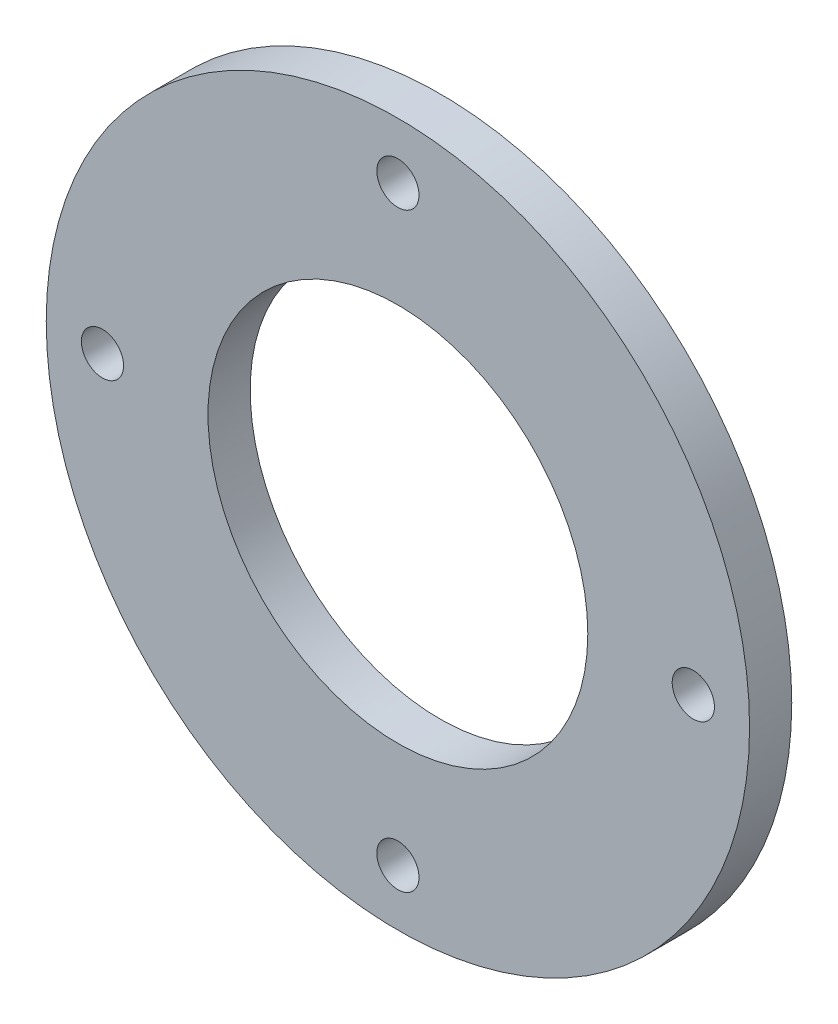
ISO-10303-21;
HEADER;
FILE_DESCRIPTION(('STEP AP214'),'2;1');
FILE_NAME('part.step','',(''),(''),'','','');
FILE_SCHEMA(('AUTOMOTIVE_DESIGN { 1 0 10303 214 1 1 1 1 }'));
ENDSEC;
DATA;
#1=APPLICATION_CONTEXT('core data for automotive mechanical design processes');
#2=APPLICATION_PROTOCOL_DEFINITION('international standard','automotive_design',2000,#1);
#3=PRODUCT_CONTEXT('',#1,'mechanical');
#4=PRODUCT('Part','Part','',(#3));
#5=PRODUCT_RELATED_PRODUCT_CATEGORY('part','',(#4));
#6=PRODUCT_DEFINITION_FORMATION('','',#4);
#7=PRODUCT_DEFINITION_CONTEXT('part definition',#1,'design');
#8=PRODUCT_DEFINITION('design','',#6,#7);
#9=PRODUCT_DEFINITION_SHAPE('','',#8);
#10=(LENGTH_UNIT() NAMED_UNIT(*) SI_UNIT(.MILLI.,.METRE.));
#11=(NAMED_UNIT(*) PLANE_ANGLE_UNIT() SI_UNIT($,.RADIAN.));
#12=(NAMED_UNIT(*) SI_UNIT($,.STERADIAN.) SOLID_ANGLE_UNIT());
#13=UNCERTAINTY_MEASURE_WITH_UNIT(LENGTH_MEASURE(1.E-05),#10,'distance_accuracy_value','');
#14=(GEOMETRIC_REPRESENTATION_CONTEXT(3) GLOBAL_UNCERTAINTY_ASSIGNED_CONTEXT((#13)) GLOBAL_UNIT_ASSIGNED_CONTEXT((#10,
#11,#12)) REPRESENTATION_CONTEXT('',''));
#15=CARTESIAN_POINT('',(0.,0.,0.));
#16=DIRECTION('',(0.,0.,1.));
#17=DIRECTION('',(1.,0.,0.));
#18=AXIS2_PLACEMENT_3D('',#15,#16,#17);
#19=CARTESIAN_POINT('',(0.,0.,3.));
#20=DIRECTION('',(0.,0.,1.));
#21=DIRECTION('',(1.,0.,0.));
#22=AXIS2_PLACEMENT_3D('',#19,#20,#21);
#23=PLANE('',#22);
#24=CARTESIAN_POINT('',(5.89140623203856E-13,-21.,3.));
#25=DIRECTION('',(0.,0.,1.));
#26=DIRECTION('',(1.,0.,0.));
#27=AXIS2_PLACEMENT_3D('',#24,#25,#26);
#28=CIRCLE('',#27,1.5000000000007);
#29=CARTESIAN_POINT('',(1.50000000000129,-21.,3.));
#30=VERTEX_POINT('',#29);
#31=EDGE_CURVE('E59',#30,#30,#28,.T.);
#32=ORIENTED_EDGE('',*,*,#31,.F.);
#33=EDGE_LOOP('',(#32));
#34=FACE_BOUND('',#33,.T.);
#35=CARTESIAN_POINT('',(0.,21.,3.));
#36=DIRECTION('',(0.,0.,1.));
#37=DIRECTION('',(1.,0.,0.));
#38=AXIS2_PLACEMENT_3D('',#35,#36,#37);
#39=CIRCLE('',#38,1.5);
#40=CARTESIAN_POINT('',(1.5,21.,3.));
#41=VERTEX_POINT('',#40);
#42=EDGE_CURVE('E47',#41,#41,#39,.T.);
#43=ORIENTED_EDGE('',*,*,#42,.F.);
#44=EDGE_LOOP('',(#43));
#45=FACE_BOUND('',#44,.T.);
#46=CARTESIAN_POINT('',(0.,0.,3.));
#47=DIRECTION('',(0.,0.,1.));
#48=DIRECTION('',(1.,0.,0.));
#49=AXIS2_PLACEMENT_3D('',#46,#47,#48);
#50=CIRCLE('',#49,25.);
#51=CARTESIAN_POINT('',(25.,0.,3.));
#52=VERTEX_POINT('',#51);
#53=EDGE_CURVE('E10',#52,#52,#50,.T.);
#54=ORIENTED_EDGE('',*,*,#53,.T.);
#55=EDGE_LOOP('',(#54));
#56=FACE_BOUND('',#55,.T.);
#57=CARTESIAN_POINT('',(0.,0.,3.));
#58=DIRECTION('',(0.,0.,1.));
#59=DIRECTION('',(1.,0.,0.));
#60=AXIS2_PLACEMENT_3D('',#57,#58,#59);
#61=CIRCLE('',#60,13.5);
#62=CARTESIAN_POINT('',(13.5,0.,3.));
#63=VERTEX_POINT('',#62);
#64=EDGE_CURVE('E42',#63,#63,#61,.T.);
#65=ORIENTED_EDGE('',*,*,#64,.F.);
#66=EDGE_LOOP('',(#65));
#67=FACE_BOUND('',#66,.T.);
#68=CARTESIAN_POINT('',(21.,0.,3.));
#69=DIRECTION('',(0.,0.,1.));
#70=DIRECTION('',(1.,0.,0.));
#71=AXIS2_PLACEMENT_3D('',#68,#69,#70);
#72=CIRCLE('',#71,1.5);
#73=CARTESIAN_POINT('',(22.5,0.,3.));
#74=VERTEX_POINT('',#73);
#75=EDGE_CURVE('E53',#74,#74,#72,.T.);
#76=ORIENTED_EDGE('',*,*,#75,.F.);
#77=EDGE_LOOP('',(#76));
#78=FACE_BOUND('',#77,.T.);
#79=CARTESIAN_POINT('',(-20.9999999999997,-2.97142069880137E-13,3.));
#80=DIRECTION('',(0.,0.,1.));
#81=DIRECTION('',(1.,0.,0.));
#82=AXIS2_PLACEMENT_3D('',#79,#80,#81);
#83=CIRCLE('',#82,1.50000000000058);
#84=CARTESIAN_POINT('',(-19.4999999999991,-2.97142069880137E-13,3.));
#85=VERTEX_POINT('',#84);
#86=EDGE_CURVE('E65',#85,#85,#83,.T.);
#87=ORIENTED_EDGE('',*,*,#86,.F.);
#88=EDGE_LOOP('',(#87));
#89=FACE_BOUND('',#88,.T.);
#90=ADVANCED_FACE('F31',(#34,#45,#56,#67,#78,#89),#23,.T.);
#91=CARTESIAN_POINT('',(0.,0.,0.));
#92=DIRECTION('',(0.,0.,1.));
#93=DIRECTION('',(1.,0.,0.));
#94=AXIS2_PLACEMENT_3D('',#91,#92,#93);
#95=PLANE('',#94);
#96=CARTESIAN_POINT('',(0.,0.,0.));
#97=DIRECTION('',(0.,0.,1.));
#98=DIRECTION('',(1.,0.,0.));
#99=AXIS2_PLACEMENT_3D('',#96,#97,#98);
#100=CIRCLE('',#99,25.);
#101=CARTESIAN_POINT('',(25.,0.,0.));
#102=VERTEX_POINT('',#101);
#103=EDGE_CURVE('E35',#102,#102,#100,.T.);
#104=ORIENTED_EDGE('',*,*,#103,.F.);
#105=EDGE_LOOP('',(#104));
#106=FACE_BOUND('',#105,.T.);
#107=CARTESIAN_POINT('',(0.,0.,0.));
#108=DIRECTION('',(0.,0.,1.));
#109=DIRECTION('',(1.,0.,0.));
#110=AXIS2_PLACEMENT_3D('',#107,#108,#109);
#111=CIRCLE('',#110,13.5);
#112=CARTESIAN_POINT('',(13.5,0.,0.));
#113=VERTEX_POINT('',#112);
#114=EDGE_CURVE('E44',#113,#113,#111,.T.);
#115=ORIENTED_EDGE('',*,*,#114,.T.);
#116=EDGE_LOOP('',(#115));
#117=FACE_BOUND('',#116,.T.);
#118=CARTESIAN_POINT('',(0.,21.,0.));
#119=DIRECTION('',(0.,0.,1.));
#120=DIRECTION('',(1.,0.,0.));
#121=AXIS2_PLACEMENT_3D('',#118,#119,#120);
#122=CIRCLE('',#121,1.5);
#123=CARTESIAN_POINT('',(1.5,21.,0.));
#124=VERTEX_POINT('',#123);
#125=EDGE_CURVE('E50',#124,#124,#122,.T.);
#126=ORIENTED_EDGE('',*,*,#125,.T.);
#127=EDGE_LOOP('',(#126));
#128=FACE_BOUND('',#127,.T.);
#129=CARTESIAN_POINT('',(21.,0.,0.));
#130=DIRECTION('',(0.,0.,1.));
#131=DIRECTION('',(1.,0.,0.));
#132=AXIS2_PLACEMENT_3D('',#129,#130,#131);
#133=CIRCLE('',#132,1.5);
#134=CARTESIAN_POINT('',(22.5,0.,0.));
#135=VERTEX_POINT('',#134);
#136=EDGE_CURVE('E56',#135,#135,#133,.T.);
#137=ORIENTED_EDGE('',*,*,#136,.T.);
#138=EDGE_LOOP('',(#137));
#139=FACE_BOUND('',#138,.T.);
#140=CARTESIAN_POINT('',(5.89140623203856E-13,-21.,0.));
#141=DIRECTION('',(0.,0.,1.));
#142=DIRECTION('',(1.,0.,0.));
#143=AXIS2_PLACEMENT_3D('',#140,#141,#142);
#144=CIRCLE('',#143,1.5000000000007);
#145=CARTESIAN_POINT('',(1.50000000000129,-21.,0.));
#146=VERTEX_POINT('',#145);
#147=EDGE_CURVE('E62',#146,#146,#144,.T.);
#148=ORIENTED_EDGE('',*,*,#147,.T.);
#149=EDGE_LOOP('',(#148));
#150=FACE_BOUND('',#149,.T.);
#151=CARTESIAN_POINT('',(-20.9999999999997,-2.97142069880137E-13,0.));
#152=DIRECTION('',(0.,0.,1.));
#153=DIRECTION('',(1.,0.,0.));
#154=AXIS2_PLACEMENT_3D('',#151,#152,#153);
#155=CIRCLE('',#154,1.50000000000058);
#156=CARTESIAN_POINT('',(-19.4999999999991,-2.97142069880137E-13,0.));
#157=VERTEX_POINT('',#156);
#158=EDGE_CURVE('E68',#157,#157,#155,.T.);
#159=ORIENTED_EDGE('',*,*,#158,.T.);
#160=EDGE_LOOP('',(#159));
#161=FACE_BOUND('',#160,.T.);
#162=ADVANCED_FACE('F78',(#106,#117,#128,#139,#150,#161),#95,.F.);
#163=CARTESIAN_POINT('',(0.,0.,3.));
#164=DIRECTION('',(0.,0.,-1.));
#165=DIRECTION('',(-1.,0.,0.));
#166=AXIS2_PLACEMENT_3D('',#163,#164,#165);
#167=CYLINDRICAL_SURFACE('',#166,25.);
#168=ORIENTED_EDGE('',*,*,#53,.F.);
#169=EDGE_LOOP('',(#168));
#170=FACE_BOUND('',#169,.T.);
#171=ORIENTED_EDGE('',*,*,#103,.T.);
#172=EDGE_LOOP('',(#171));
#173=FACE_BOUND('',#172,.T.);
#174=ADVANCED_FACE('F33',(#170,#173),#167,.T.);
#175=CARTESIAN_POINT('',(0.,0.,3.));
#176=DIRECTION('',(0.,0.,-1.));
#177=DIRECTION('',(-1.,0.,0.));
#178=AXIS2_PLACEMENT_3D('',#175,#176,#177);
#179=CYLINDRICAL_SURFACE('',#178,13.5);
#180=ORIENTED_EDGE('',*,*,#64,.T.);
#181=EDGE_LOOP('',(#180));
#182=FACE_BOUND('',#181,.T.);
#183=ORIENTED_EDGE('',*,*,#114,.F.);
#184=EDGE_LOOP('',(#183));
#185=FACE_BOUND('',#184,.T.);
#186=ADVANCED_FACE('F88',(#182,#185),#179,.F.);
#187=CARTESIAN_POINT('',(0.,21.,3.));
#188=DIRECTION('',(0.,0.,-1.));
#189=DIRECTION('',(-1.,0.,0.));
#190=AXIS2_PLACEMENT_3D('',#187,#188,#189);
#191=CYLINDRICAL_SURFACE('',#190,1.5);
#192=ORIENTED_EDGE('',*,*,#42,.T.);
#193=EDGE_LOOP('',(#192));
#194=FACE_BOUND('',#193,.T.);
#195=ORIENTED_EDGE('',*,*,#125,.F.);
#196=EDGE_LOOP('',(#195));
#197=FACE_BOUND('',#196,.T.);
#198=ADVANCED_FACE('F91',(#194,#197),#191,.F.);
#199=CARTESIAN_POINT('',(21.,0.,3.));
#200=DIRECTION('',(0.,0.,-1.));
#201=DIRECTION('',(-1.,0.,0.));
#202=AXIS2_PLACEMENT_3D('',#199,#200,#201);
#203=CYLINDRICAL_SURFACE('',#202,1.5);
#204=ORIENTED_EDGE('',*,*,#75,.T.);
#205=EDGE_LOOP('',(#204));
#206=FACE_BOUND('',#205,.T.);
#207=ORIENTED_EDGE('',*,*,#136,.F.);
#208=EDGE_LOOP('',(#207));
#209=FACE_BOUND('',#208,.T.);
#210=ADVANCED_FACE('F95',(#206,#209),#203,.F.);
#211=CARTESIAN_POINT('',(5.89140623203856E-13,-21.,3.));
#212=DIRECTION('',(0.,0.,-1.));
#213=DIRECTION('',(-1.,0.,0.));
#214=AXIS2_PLACEMENT_3D('',#211,#212,#213);
#215=CYLINDRICAL_SURFACE('',#214,1.5000000000007);
#216=ORIENTED_EDGE('',*,*,#31,.T.);
#217=EDGE_LOOP('',(#216));
#218=FACE_BOUND('',#217,.T.);
#219=ORIENTED_EDGE('',*,*,#147,.F.);
#220=EDGE_LOOP('',(#219));
#221=FACE_BOUND('',#220,.T.);
#222=ADVANCED_FACE('F99',(#218,#221),#215,.F.);
#223=CARTESIAN_POINT('',(-20.9999999999997,-2.97142069880137E-13,3.));
#224=DIRECTION('',(0.,0.,-1.));
#225=DIRECTION('',(-1.,0.,0.));
#226=AXIS2_PLACEMENT_3D('',#223,#224,#225);
#227=CYLINDRICAL_SURFACE('',#226,1.50000000000058);
#228=ORIENTED_EDGE('',*,*,#86,.T.);
#229=EDGE_LOOP('',(#228));
#230=FACE_BOUND('',#229,.T.);
#231=ORIENTED_EDGE('',*,*,#158,.F.);
#232=EDGE_LOOP('',(#231));
#233=FACE_BOUND('',#232,.T.);
#234=ADVANCED_FACE('F74',(#230,#233),#227,.F.);
#235=CLOSED_SHELL('',(#90,#162,#174,#186,#198,#210,#222,#234));
#236=MANIFOLD_SOLID_BREP('B2',#235);
#237=ADVANCED_BREP_SHAPE_REPRESENTATION('',(#18,#236),#14);
#238=SHAPE_DEFINITION_REPRESENTATION(#9,#237);
ENDSEC;
END-ISO-10303-21;
